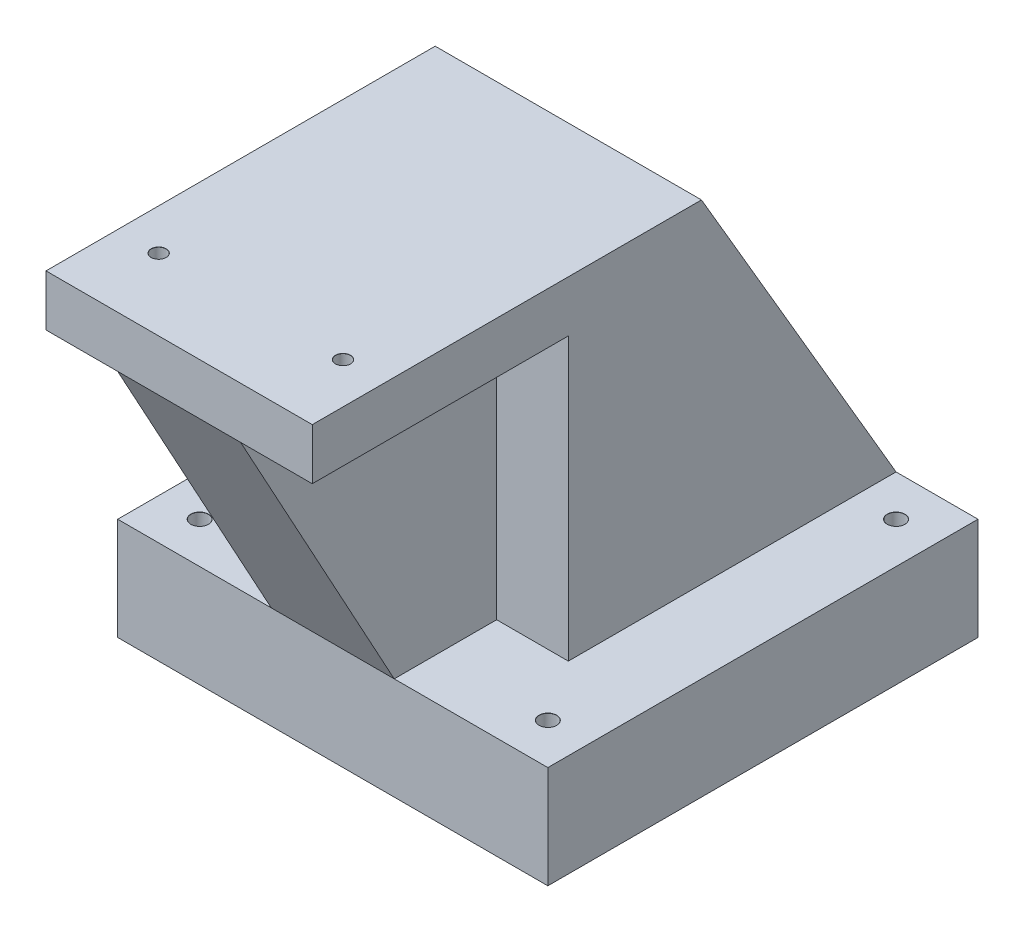
ISO-10303-21;
HEADER;
FILE_DESCRIPTION(('STEP AP214'),'2;1');
FILE_NAME('part.step','',(''),(''),'','','');
FILE_SCHEMA(('AUTOMOTIVE_DESIGN { 1 0 10303 214 1 1 1 1 }'));
ENDSEC;
DATA;
#1=APPLICATION_CONTEXT('core data for automotive mechanical design processes');
#2=APPLICATION_PROTOCOL_DEFINITION('international standard','automotive_design',2000,#1);
#3=PRODUCT_CONTEXT('',#1,'mechanical');
#4=PRODUCT('Part','Part','',(#3));
#5=PRODUCT_RELATED_PRODUCT_CATEGORY('part','',(#4));
#6=PRODUCT_DEFINITION_FORMATION('','',#4);
#7=PRODUCT_DEFINITION_CONTEXT('part definition',#1,'design');
#8=PRODUCT_DEFINITION('design','',#6,#7);
#9=PRODUCT_DEFINITION_SHAPE('','',#8);
#10=(LENGTH_UNIT() NAMED_UNIT(*) SI_UNIT(.MILLI.,.METRE.));
#11=(NAMED_UNIT(*) PLANE_ANGLE_UNIT() SI_UNIT($,.RADIAN.));
#12=(NAMED_UNIT(*) SI_UNIT($,.STERADIAN.) SOLID_ANGLE_UNIT());
#13=UNCERTAINTY_MEASURE_WITH_UNIT(LENGTH_MEASURE(1.E-05),#10,'distance_accuracy_value','');
#14=(GEOMETRIC_REPRESENTATION_CONTEXT(3) GLOBAL_UNCERTAINTY_ASSIGNED_CONTEXT((#13)) GLOBAL_UNIT_ASSIGNED_CONTEXT((#10,
#11,#12)) REPRESENTATION_CONTEXT('',''));
#15=CARTESIAN_POINT('',(0.,0.,0.));
#16=DIRECTION('',(0.,0.,1.));
#17=DIRECTION('',(1.,0.,0.));
#18=AXIS2_PLACEMENT_3D('',#15,#16,#17);
#19=CARTESIAN_POINT('',(0.,20.,0.));
#20=DIRECTION('',(0.,1.,0.));
#21=DIRECTION('',(0.,0.,1.));
#22=AXIS2_PLACEMENT_3D('',#19,#20,#21);
#23=PLANE('',#22);
#24=DIRECTION('',(0.,0.,1.));
#25=VECTOR('',#24,1.);
#26=CARTESIAN_POINT('',(-42.,20.,-42.));
#27=LINE('',#26,#25);
#28=CARTESIAN_POINT('',(-42.,20.,-42.));
#29=VERTEX_POINT('',#28);
#30=CARTESIAN_POINT('',(-42.,20.,42.));
#31=VERTEX_POINT('',#30);
#32=EDGE_CURVE('E244',#29,#31,#27,.T.);
#33=ORIENTED_EDGE('',*,*,#32,.T.);
#34=DIRECTION('',(1.,0.,0.));
#35=VECTOR('',#34,1.);
#36=CARTESIAN_POINT('',(-42.,20.,42.));
#37=LINE('',#36,#35);
#38=CARTESIAN_POINT('',(-12.,20.,42.));
#39=VERTEX_POINT('',#38);
#40=EDGE_CURVE('E112',#31,#39,#37,.T.);
#41=ORIENTED_EDGE('',*,*,#40,.T.);
#42=DIRECTION('',(0.,0.,1.));
#43=VECTOR('',#42,1.);
#44=CARTESIAN_POINT('',(-12.,20.,22.));
#45=LINE('',#44,#43);
#46=CARTESIAN_POINT('',(-12.,20.,22.));
#47=VERTEX_POINT('',#46);
#48=EDGE_CURVE('E178',#47,#39,#45,.T.);
#49=ORIENTED_EDGE('',*,*,#48,.F.);
#50=DIRECTION('',(1.,0.,0.));
#51=VECTOR('',#50,1.);
#52=CARTESIAN_POINT('',(-42.,20.,22.));
#53=LINE('',#52,#51);
#54=CARTESIAN_POINT('',(-26.,20.,22.));
#55=VERTEX_POINT('',#54);
#56=EDGE_CURVE('E168',#55,#47,#53,.T.);
#57=ORIENTED_EDGE('',*,*,#56,.F.);
#58=DIRECTION('',(0.,0.,1.));
#59=VECTOR('',#58,1.);
#60=CARTESIAN_POINT('',(-26.,20.,-4.));
#61=LINE('',#60,#59);
#62=CARTESIAN_POINT('',(-26.,20.,-42.));
#63=VERTEX_POINT('',#62);
#64=EDGE_CURVE('E209',#63,#55,#61,.T.);
#65=ORIENTED_EDGE('',*,*,#64,.F.);
#66=DIRECTION('',(-1.,0.,0.));
#67=VECTOR('',#66,1.);
#68=CARTESIAN_POINT('',(-42.,20.,-42.));
#69=LINE('',#68,#67);
#70=EDGE_CURVE('E71',#63,#29,#69,.T.);
#71=ORIENTED_EDGE('',*,*,#70,.T.);
#72=EDGE_LOOP('',(#33,#41,#49,#57,#65,#71));
#73=FACE_BOUND('',#72,.T.);
#74=CARTESIAN_POINT('',(-34.,20.,-34.));
#75=DIRECTION('',(0.,1.,0.));
#76=DIRECTION('',(0.,0.,1.));
#77=AXIS2_PLACEMENT_3D('',#74,#75,#76);
#78=CIRCLE('',#77,1.725);
#79=CARTESIAN_POINT('',(-34.,20.,-32.275));
#80=VERTEX_POINT('',#79);
#81=EDGE_CURVE('E208',#80,#80,#78,.T.);
#82=ORIENTED_EDGE('',*,*,#81,.F.);
#83=EDGE_LOOP('',(#82));
#84=FACE_BOUND('',#83,.T.);
#85=CARTESIAN_POINT('',(-34.,20.,34.));
#86=DIRECTION('',(0.,1.,0.));
#87=DIRECTION('',(0.,0.,1.));
#88=AXIS2_PLACEMENT_3D('',#85,#86,#87);
#89=CIRCLE('',#88,1.725);
#90=CARTESIAN_POINT('',(-34.,20.,35.725));
#91=VERTEX_POINT('',#90);
#92=EDGE_CURVE('E191',#91,#91,#89,.T.);
#93=ORIENTED_EDGE('',*,*,#92,.F.);
#94=EDGE_LOOP('',(#93));
#95=FACE_BOUND('',#94,.T.);
#96=ADVANCED_FACE('F47',(#73,#84,#95),#23,.T.);
#97=CARTESIAN_POINT('',(42.,20.,-42.));
#98=DIRECTION('',(-1.,0.,0.));
#99=DIRECTION('',(0.,0.,1.));
#100=AXIS2_PLACEMENT_3D('',#97,#98,#99);
#101=PLANE('',#100);
#102=DIRECTION('',(0.,0.,-1.));
#103=VECTOR('',#102,1.);
#104=CARTESIAN_POINT('',(42.,20.,-42.));
#105=LINE('',#104,#103);
#106=CARTESIAN_POINT('',(42.,20.,42.));
#107=VERTEX_POINT('',#106);
#108=CARTESIAN_POINT('',(42.,20.,-42.));
#109=VERTEX_POINT('',#108);
#110=EDGE_CURVE('E103',#107,#109,#105,.T.);
#111=ORIENTED_EDGE('',*,*,#110,.F.);
#112=DIRECTION('',(0.,-1.,0.));
#113=VECTOR('',#112,1.);
#114=CARTESIAN_POINT('',(42.,20.,42.));
#115=LINE('',#114,#113);
#116=CARTESIAN_POINT('',(42.,0.,42.));
#117=VERTEX_POINT('',#116);
#118=EDGE_CURVE('E96',#107,#117,#115,.T.);
#119=ORIENTED_EDGE('',*,*,#118,.T.);
#120=DIRECTION('',(0.,0.,-1.));
#121=VECTOR('',#120,1.);
#122=CARTESIAN_POINT('',(42.,0.,-42.));
#123=LINE('',#122,#121);
#124=CARTESIAN_POINT('',(42.,0.,-42.));
#125=VERTEX_POINT('',#124);
#126=EDGE_CURVE('E110',#117,#125,#123,.T.);
#127=ORIENTED_EDGE('',*,*,#126,.T.);
#128=DIRECTION('',(0.,-1.,0.));
#129=VECTOR('',#128,1.);
#130=CARTESIAN_POINT('',(42.,20.,-42.));
#131=LINE('',#130,#129);
#132=EDGE_CURVE('E131',#109,#125,#131,.T.);
#133=ORIENTED_EDGE('',*,*,#132,.F.);
#134=EDGE_LOOP('',(#111,#119,#127,#133));
#135=FACE_BOUND('',#134,.T.);
#136=ADVANCED_FACE('F49',(#135),#101,.F.);
#137=CARTESIAN_POINT('',(-42.,20.,-42.));
#138=DIRECTION('',(0.,0.,1.));
#139=DIRECTION('',(1.,0.,0.));
#140=AXIS2_PLACEMENT_3D('',#137,#138,#139);
#141=PLANE('',#140);
#142=ORIENTED_EDGE('',*,*,#70,.F.);
#143=DIRECTION('',(1.,0.,0.));
#144=VECTOR('',#143,1.);
#145=CARTESIAN_POINT('',(-204.,20.,-42.));
#146=LINE('',#145,#144);
#147=CARTESIAN_POINT('',(26.,20.,-42.));
#148=VERTEX_POINT('',#147);
#149=EDGE_CURVE('E333',#63,#148,#146,.T.);
#150=ORIENTED_EDGE('',*,*,#149,.T.);
#151=EDGE_CURVE('E243',#109,#148,#69,.T.);
#152=ORIENTED_EDGE('',*,*,#151,.F.);
#153=ORIENTED_EDGE('',*,*,#132,.T.);
#154=DIRECTION('',(-1.,0.,0.));
#155=VECTOR('',#154,1.);
#156=CARTESIAN_POINT('',(-42.,0.,-42.));
#157=LINE('',#156,#155);
#158=CARTESIAN_POINT('',(-42.,0.,-42.));
#159=VERTEX_POINT('',#158);
#160=EDGE_CURVE('E115',#125,#159,#157,.T.);
#161=ORIENTED_EDGE('',*,*,#160,.T.);
#162=DIRECTION('',(0.,-1.,0.));
#163=VECTOR('',#162,1.);
#164=CARTESIAN_POINT('',(-42.,20.,-42.));
#165=LINE('',#164,#163);
#166=EDGE_CURVE('E128',#29,#159,#165,.T.);
#167=ORIENTED_EDGE('',*,*,#166,.F.);
#168=EDGE_LOOP('',(#142,#150,#152,#153,#161,#167));
#169=FACE_BOUND('',#168,.T.);
#170=ADVANCED_FACE('F383',(#169),#141,.F.);
#171=CARTESIAN_POINT('',(-42.,20.,-42.));
#172=DIRECTION('',(1.,0.,0.));
#173=DIRECTION('',(0.,0.,-1.));
#174=AXIS2_PLACEMENT_3D('',#171,#172,#173);
#175=PLANE('',#174);
#176=DIRECTION('',(0.,-1.,0.));
#177=VECTOR('',#176,1.);
#178=CARTESIAN_POINT('',(-42.,20.,42.));
#179=LINE('',#178,#177);
#180=CARTESIAN_POINT('',(-42.,0.,42.));
#181=VERTEX_POINT('',#180);
#182=EDGE_CURVE('E99',#31,#181,#179,.T.);
#183=ORIENTED_EDGE('',*,*,#182,.F.);
#184=ORIENTED_EDGE('',*,*,#32,.F.);
#185=ORIENTED_EDGE('',*,*,#166,.T.);
#186=DIRECTION('',(0.,0.,1.));
#187=VECTOR('',#186,1.);
#188=CARTESIAN_POINT('',(-42.,0.,-42.));
#189=LINE('',#188,#187);
#190=EDGE_CURVE('E104',#159,#181,#189,.T.);
#191=ORIENTED_EDGE('',*,*,#190,.T.);
#192=EDGE_LOOP('',(#183,#184,#185,#191));
#193=FACE_BOUND('',#192,.T.);
#194=ADVANCED_FACE('F393',(#193),#175,.F.);
#195=CARTESIAN_POINT('',(-42.,20.,42.));
#196=DIRECTION('',(0.,0.,-1.));
#197=DIRECTION('',(-1.,0.,0.));
#198=AXIS2_PLACEMENT_3D('',#195,#196,#197);
#199=PLANE('',#198);
#200=DIRECTION('',(1.,0.,0.));
#201=VECTOR('',#200,1.);
#202=CARTESIAN_POINT('',(-42.,0.,42.));
#203=LINE('',#202,#201);
#204=EDGE_CURVE('E92',#181,#117,#203,.T.);
#205=ORIENTED_EDGE('',*,*,#204,.T.);
#206=ORIENTED_EDGE('',*,*,#118,.F.);
#207=CARTESIAN_POINT('',(12.,20.,42.));
#208=VERTEX_POINT('',#207);
#209=EDGE_CURVE('E245',#208,#107,#37,.T.);
#210=ORIENTED_EDGE('',*,*,#209,.F.);
#211=EDGE_CURVE('E249',#39,#208,#37,.T.);
#212=ORIENTED_EDGE('',*,*,#211,.F.);
#213=ORIENTED_EDGE('',*,*,#40,.F.);
#214=ORIENTED_EDGE('',*,*,#182,.T.);
#215=EDGE_LOOP('',(#205,#206,#210,#212,#213,#214));
#216=FACE_BOUND('',#215,.T.);
#217=ADVANCED_FACE('F94',(#216),#199,.F.);
#218=DIRECTION('',(0.,0.,-1.));
#219=VECTOR('',#218,1.);
#220=CARTESIAN_POINT('',(26.,20.,-4.));
#221=LINE('',#220,#219);
#222=CARTESIAN_POINT('',(26.,20.,22.));
#223=VERTEX_POINT('',#222);
#224=EDGE_CURVE('E62',#223,#148,#221,.T.);
#225=ORIENTED_EDGE('',*,*,#224,.F.);
#226=DIRECTION('',(1.,0.,0.));
#227=VECTOR('',#226,1.);
#228=CARTESIAN_POINT('',(42.,20.,22.));
#229=LINE('',#228,#227);
#230=CARTESIAN_POINT('',(12.,20.,22.));
#231=VERTEX_POINT('',#230);
#232=EDGE_CURVE('E147',#231,#223,#229,.T.);
#233=ORIENTED_EDGE('',*,*,#232,.F.);
#234=DIRECTION('',(0.,0.,1.));
#235=VECTOR('',#234,1.);
#236=CARTESIAN_POINT('',(12.,20.,22.));
#237=LINE('',#236,#235);
#238=EDGE_CURVE('E156',#231,#208,#237,.T.);
#239=ORIENTED_EDGE('',*,*,#238,.T.);
#240=ORIENTED_EDGE('',*,*,#209,.T.);
#241=ORIENTED_EDGE('',*,*,#110,.T.);
#242=ORIENTED_EDGE('',*,*,#151,.T.);
#243=EDGE_LOOP('',(#225,#233,#239,#240,#241,#242));
#244=FACE_BOUND('',#243,.T.);
#245=CARTESIAN_POINT('',(34.,20.,-34.));
#246=DIRECTION('',(0.,1.,0.));
#247=DIRECTION('',(0.,0.,1.));
#248=AXIS2_PLACEMENT_3D('',#245,#246,#247);
#249=CIRCLE('',#248,1.725);
#250=CARTESIAN_POINT('',(34.,20.,-32.275));
#251=VERTEX_POINT('',#250);
#252=EDGE_CURVE('E221',#251,#251,#249,.T.);
#253=ORIENTED_EDGE('',*,*,#252,.F.);
#254=EDGE_LOOP('',(#253));
#255=FACE_BOUND('',#254,.T.);
#256=CARTESIAN_POINT('',(34.,20.,34.));
#257=DIRECTION('',(0.,1.,0.));
#258=DIRECTION('',(0.,0.,1.));
#259=AXIS2_PLACEMENT_3D('',#256,#257,#258);
#260=CIRCLE('',#259,1.725);
#261=CARTESIAN_POINT('',(34.,20.,35.725));
#262=VERTEX_POINT('',#261);
#263=EDGE_CURVE('E196',#262,#262,#260,.T.);
#264=ORIENTED_EDGE('',*,*,#263,.F.);
#265=EDGE_LOOP('',(#264));
#266=FACE_BOUND('',#265,.T.);
#267=ADVANCED_FACE('F353',(#244,#255,#266),#23,.T.);
#268=CARTESIAN_POINT('',(0.,0.,0.));
#269=DIRECTION('',(0.,1.,0.));
#270=DIRECTION('',(0.,0.,1.));
#271=AXIS2_PLACEMENT_3D('',#268,#269,#270);
#272=PLANE('',#271);
#273=CARTESIAN_POINT('',(-34.,0.,-34.));
#274=DIRECTION('',(0.,1.,0.));
#275=DIRECTION('',(0.,0.,1.));
#276=AXIS2_PLACEMENT_3D('',#273,#274,#275);
#277=CIRCLE('',#276,1.69999999999999);
#278=CARTESIAN_POINT('',(-34.,0.,-32.3));
#279=VERTEX_POINT('',#278);
#280=EDGE_CURVE('E218',#279,#279,#277,.T.);
#281=ORIENTED_EDGE('',*,*,#280,.T.);
#282=EDGE_LOOP('',(#281));
#283=FACE_BOUND('',#282,.T.);
#284=CARTESIAN_POINT('',(34.,0.,-34.));
#285=DIRECTION('',(0.,1.,0.));
#286=DIRECTION('',(0.,0.,1.));
#287=AXIS2_PLACEMENT_3D('',#284,#285,#286);
#288=CIRCLE('',#287,1.69999999999999);
#289=CARTESIAN_POINT('',(34.,0.,-32.3));
#290=VERTEX_POINT('',#289);
#291=EDGE_CURVE('E227',#290,#290,#288,.T.);
#292=ORIENTED_EDGE('',*,*,#291,.T.);
#293=EDGE_LOOP('',(#292));
#294=FACE_BOUND('',#293,.T.);
#295=CARTESIAN_POINT('',(34.,0.,34.));
#296=DIRECTION('',(0.,1.,0.));
#297=DIRECTION('',(0.,0.,1.));
#298=AXIS2_PLACEMENT_3D('',#295,#296,#297);
#299=CIRCLE('',#298,1.69999999999999);
#300=CARTESIAN_POINT('',(34.,0.,35.7));
#301=VERTEX_POINT('',#300);
#302=EDGE_CURVE('E235',#301,#301,#299,.T.);
#303=ORIENTED_EDGE('',*,*,#302,.T.);
#304=EDGE_LOOP('',(#303));
#305=FACE_BOUND('',#304,.T.);
#306=CARTESIAN_POINT('',(-34.,0.,34.));
#307=DIRECTION('',(0.,1.,0.));
#308=DIRECTION('',(0.,0.,1.));
#309=AXIS2_PLACEMENT_3D('',#306,#307,#308);
#310=CIRCLE('',#309,1.69999999999999);
#311=CARTESIAN_POINT('',(-34.,0.,35.7));
#312=VERTEX_POINT('',#311);
#313=EDGE_CURVE('E117',#312,#312,#310,.T.);
#314=ORIENTED_EDGE('',*,*,#313,.T.);
#315=EDGE_LOOP('',(#314));
#316=FACE_BOUND('',#315,.T.);
#317=ORIENTED_EDGE('',*,*,#126,.F.);
#318=ORIENTED_EDGE('',*,*,#204,.F.);
#319=ORIENTED_EDGE('',*,*,#190,.F.);
#320=ORIENTED_EDGE('',*,*,#160,.F.);
#321=EDGE_LOOP('',(#317,#318,#319,#320));
#322=FACE_BOUND('',#321,.T.);
#323=ADVANCED_FACE('F114',(#283,#294,#305,#316,#322),#272,.F.);
#324=CARTESIAN_POINT('',(-34.,20.,34.));
#325=DIRECTION('',(0.,1.,0.));
#326=DIRECTION('',(0.,0.,1.));
#327=AXIS2_PLACEMENT_3D('',#324,#325,#326);
#328=CYLINDRICAL_SURFACE('',#327,1.69999999999999);
#329=ORIENTED_EDGE('',*,*,#313,.F.);
#330=EDGE_LOOP('',(#329));
#331=FACE_BOUND('',#330,.T.);
#332=CARTESIAN_POINT('',(-34.,19.975,34.));
#333=DIRECTION('',(0.,1.,0.));
#334=DIRECTION('',(0.,0.,1.));
#335=AXIS2_PLACEMENT_3D('',#332,#333,#334);
#336=CIRCLE('',#335,1.69999999999999);
#337=CARTESIAN_POINT('',(-34.,19.975,35.7));
#338=VERTEX_POINT('',#337);
#339=EDGE_CURVE('E121',#338,#338,#336,.T.);
#340=ORIENTED_EDGE('',*,*,#339,.T.);
#341=EDGE_LOOP('',(#340));
#342=FACE_BOUND('',#341,.T.);
#343=ADVANCED_FACE('F386',(#331,#342),#328,.F.);
#344=CARTESIAN_POINT('',(-34.,20.,34.));
#345=DIRECTION('',(0.,1.,0.));
#346=DIRECTION('',(0.,0.,1.));
#347=AXIS2_PLACEMENT_3D('',#344,#345,#346);
#348=CONICAL_SURFACE('',#347,1.725,0.785398163397101);
#349=ORIENTED_EDGE('',*,*,#339,.F.);
#350=EDGE_LOOP('',(#349));
#351=FACE_BOUND('',#350,.T.);
#352=ORIENTED_EDGE('',*,*,#92,.T.);
#353=EDGE_LOOP('',(#352));
#354=FACE_BOUND('',#353,.T.);
#355=ADVANCED_FACE('F374',(#351,#354),#348,.F.);
#356=CARTESIAN_POINT('',(34.,20.,34.));
#357=DIRECTION('',(0.,1.,0.));
#358=DIRECTION('',(0.,0.,1.));
#359=AXIS2_PLACEMENT_3D('',#356,#357,#358);
#360=CYLINDRICAL_SURFACE('',#359,1.69999999999999);
#361=ORIENTED_EDGE('',*,*,#302,.F.);
#362=EDGE_LOOP('',(#361));
#363=FACE_BOUND('',#362,.T.);
#364=CARTESIAN_POINT('',(34.,19.975,34.));
#365=DIRECTION('',(0.,1.,0.));
#366=DIRECTION('',(0.,0.,1.));
#367=AXIS2_PLACEMENT_3D('',#364,#365,#366);
#368=CIRCLE('',#367,1.69999999999999);
#369=CARTESIAN_POINT('',(34.,19.975,35.7));
#370=VERTEX_POINT('',#369);
#371=EDGE_CURVE('E230',#370,#370,#368,.T.);
#372=ORIENTED_EDGE('',*,*,#371,.T.);
#373=EDGE_LOOP('',(#372));
#374=FACE_BOUND('',#373,.T.);
#375=ADVANCED_FACE('F364',(#363,#374),#360,.F.);
#376=CARTESIAN_POINT('',(34.,20.,34.));
#377=DIRECTION('',(0.,1.,0.));
#378=DIRECTION('',(0.,0.,1.));
#379=AXIS2_PLACEMENT_3D('',#376,#377,#378);
#380=CONICAL_SURFACE('',#379,1.725,0.785398163397101);
#381=ORIENTED_EDGE('',*,*,#371,.F.);
#382=EDGE_LOOP('',(#381));
#383=FACE_BOUND('',#382,.T.);
#384=ORIENTED_EDGE('',*,*,#263,.T.);
#385=EDGE_LOOP('',(#384));
#386=FACE_BOUND('',#385,.T.);
#387=ADVANCED_FACE('F361',(#383,#386),#380,.F.);
#388=CARTESIAN_POINT('',(34.,20.,-34.));
#389=DIRECTION('',(0.,1.,0.));
#390=DIRECTION('',(0.,0.,1.));
#391=AXIS2_PLACEMENT_3D('',#388,#389,#390);
#392=CYLINDRICAL_SURFACE('',#391,1.69999999999999);
#393=ORIENTED_EDGE('',*,*,#291,.F.);
#394=EDGE_LOOP('',(#393));
#395=FACE_BOUND('',#394,.T.);
#396=CARTESIAN_POINT('',(34.,19.975,-34.));
#397=DIRECTION('',(0.,1.,0.));
#398=DIRECTION('',(0.,0.,1.));
#399=AXIS2_PLACEMENT_3D('',#396,#397,#398);
#400=CIRCLE('',#399,1.69999999999999);
#401=CARTESIAN_POINT('',(34.,19.975,-32.3));
#402=VERTEX_POINT('',#401);
#403=EDGE_CURVE('E224',#402,#402,#400,.T.);
#404=ORIENTED_EDGE('',*,*,#403,.T.);
#405=EDGE_LOOP('',(#404));
#406=FACE_BOUND('',#405,.T.);
#407=ADVANCED_FACE('F363',(#395,#406),#392,.F.);
#408=CARTESIAN_POINT('',(34.,20.,-34.));
#409=DIRECTION('',(0.,1.,0.));
#410=DIRECTION('',(0.,0.,1.));
#411=AXIS2_PLACEMENT_3D('',#408,#409,#410);
#412=CONICAL_SURFACE('',#411,1.725,0.78539816339724);
#413=ORIENTED_EDGE('',*,*,#403,.F.);
#414=EDGE_LOOP('',(#413));
#415=FACE_BOUND('',#414,.T.);
#416=ORIENTED_EDGE('',*,*,#252,.T.);
#417=EDGE_LOOP('',(#416));
#418=FACE_BOUND('',#417,.T.);
#419=ADVANCED_FACE('F371',(#415,#418),#412,.F.);
#420=CARTESIAN_POINT('',(-34.,20.,-34.));
#421=DIRECTION('',(0.,1.,0.));
#422=DIRECTION('',(0.,0.,1.));
#423=AXIS2_PLACEMENT_3D('',#420,#421,#422);
#424=CYLINDRICAL_SURFACE('',#423,1.69999999999999);
#425=ORIENTED_EDGE('',*,*,#280,.F.);
#426=EDGE_LOOP('',(#425));
#427=FACE_BOUND('',#426,.T.);
#428=CARTESIAN_POINT('',(-34.,19.975,-34.));
#429=DIRECTION('',(0.,1.,0.));
#430=DIRECTION('',(0.,0.,1.));
#431=AXIS2_PLACEMENT_3D('',#428,#429,#430);
#432=CIRCLE('',#431,1.69999999999999);
#433=CARTESIAN_POINT('',(-34.,19.975,-32.3));
#434=VERTEX_POINT('',#433);
#435=EDGE_CURVE('E215',#434,#434,#432,.T.);
#436=ORIENTED_EDGE('',*,*,#435,.T.);
#437=EDGE_LOOP('',(#436));
#438=FACE_BOUND('',#437,.T.);
#439=ADVANCED_FACE('F433',(#427,#438),#424,.F.);
#440=CARTESIAN_POINT('',(-34.,20.,-34.));
#441=DIRECTION('',(0.,1.,0.));
#442=DIRECTION('',(0.,0.,1.));
#443=AXIS2_PLACEMENT_3D('',#440,#441,#442);
#444=CONICAL_SURFACE('',#443,1.725,0.78539816339724);
#445=ORIENTED_EDGE('',*,*,#435,.F.);
#446=EDGE_LOOP('',(#445));
#447=FACE_BOUND('',#446,.T.);
#448=ORIENTED_EDGE('',*,*,#81,.T.);
#449=EDGE_LOOP('',(#448));
#450=FACE_BOUND('',#449,.T.);
#451=ADVANCED_FACE('F424',(#447,#450),#444,.F.);
#452=CARTESIAN_POINT('',(0.,85.,0.));
#453=DIRECTION('',(0.,1.,0.));
#454=DIRECTION('',(0.,0.,1.));
#455=AXIS2_PLACEMENT_3D('',#452,#453,#454);
#456=PLANE('',#455);
#457=DIRECTION('',(0.,0.,-1.));
#458=VECTOR('',#457,1.);
#459=CARTESIAN_POINT('',(26.,85.,226.));
#460=LINE('',#459,#458);
#461=CARTESIAN_POINT('',(26.,85.,72.));
#462=VERTEX_POINT('',#461);
#463=CARTESIAN_POINT('',(26.,85.,-4.));
#464=VERTEX_POINT('',#463);
#465=EDGE_CURVE('E316',#462,#464,#460,.T.);
#466=ORIENTED_EDGE('',*,*,#465,.T.);
#467=DIRECTION('',(1.,0.,0.));
#468=VECTOR('',#467,1.);
#469=CARTESIAN_POINT('',(-204.,85.,-4.));
#470=LINE('',#469,#468);
#471=CARTESIAN_POINT('',(-26.,85.,-4.));
#472=VERTEX_POINT('',#471);
#473=EDGE_CURVE('E321',#472,#464,#470,.T.);
#474=ORIENTED_EDGE('',*,*,#473,.F.);
#475=DIRECTION('',(0.,0.,-1.));
#476=VECTOR('',#475,1.);
#477=CARTESIAN_POINT('',(-26.,85.,226.));
#478=LINE('',#477,#476);
#479=CARTESIAN_POINT('',(-26.,85.,72.));
#480=VERTEX_POINT('',#479);
#481=EDGE_CURVE('E324',#480,#472,#478,.T.);
#482=ORIENTED_EDGE('',*,*,#481,.F.);
#483=DIRECTION('',(1.,0.,0.));
#484=VECTOR('',#483,1.);
#485=CARTESIAN_POINT('',(-42.,85.,72.));
#486=LINE('',#485,#484);
#487=EDGE_CURVE('E205',#480,#462,#486,.T.);
#488=ORIENTED_EDGE('',*,*,#487,.T.);
#489=EDGE_LOOP('',(#466,#474,#482,#488));
#490=FACE_BOUND('',#489,.T.);
#491=CARTESIAN_POINT('',(-18.,85.,58.));
#492=DIRECTION('',(0.,1.,0.));
#493=DIRECTION('',(0.,0.,1.));
#494=AXIS2_PLACEMENT_3D('',#491,#492,#493);
#495=CIRCLE('',#494,1.475);
#496=CARTESIAN_POINT('',(-18.,85.,59.475));
#497=VERTEX_POINT('',#496);
#498=EDGE_CURVE('E192',#497,#497,#495,.T.);
#499=ORIENTED_EDGE('',*,*,#498,.F.);
#500=EDGE_LOOP('',(#499));
#501=FACE_BOUND('',#500,.T.);
#502=CARTESIAN_POINT('',(18.,85.,58.));
#503=DIRECTION('',(0.,1.,0.));
#504=DIRECTION('',(0.,0.,1.));
#505=AXIS2_PLACEMENT_3D('',#502,#503,#504);
#506=CIRCLE('',#505,1.475);
#507=CARTESIAN_POINT('',(18.,85.,59.475));
#508=VERTEX_POINT('',#507);
#509=EDGE_CURVE('E199',#508,#508,#506,.T.);
#510=ORIENTED_EDGE('',*,*,#509,.F.);
#511=EDGE_LOOP('',(#510));
#512=FACE_BOUND('',#511,.T.);
#513=ADVANCED_FACE('F318',(#490,#501,#512),#456,.T.);
#514=CARTESIAN_POINT('',(-42.,85.,72.));
#515=DIRECTION('',(0.,0.,-1.));
#516=DIRECTION('',(-1.,0.,0.));
#517=AXIS2_PLACEMENT_3D('',#514,#515,#516);
#518=PLANE('',#517);
#519=DIRECTION('',(-1.,0.,0.));
#520=VECTOR('',#519,1.);
#521=CARTESIAN_POINT('',(42.,75.,72.));
#522=LINE('',#521,#520);
#523=CARTESIAN_POINT('',(26.,75.,72.));
#524=VERTEX_POINT('',#523);
#525=CARTESIAN_POINT('',(12.,75.,72.));
#526=VERTEX_POINT('',#525);
#527=EDGE_CURVE('E162',#524,#526,#522,.T.);
#528=ORIENTED_EDGE('',*,*,#527,.F.);
#529=DIRECTION('',(0.,1.,0.));
#530=VECTOR('',#529,1.);
#531=CARTESIAN_POINT('',(26.,85.,72.));
#532=LINE('',#531,#530);
#533=EDGE_CURVE('E411',#524,#462,#532,.T.);
#534=ORIENTED_EDGE('',*,*,#533,.T.);
#535=ORIENTED_EDGE('',*,*,#487,.F.);
#536=DIRECTION('',(0.,-1.,0.));
#537=VECTOR('',#536,1.);
#538=CARTESIAN_POINT('',(-26.,85.,72.));
#539=LINE('',#538,#537);
#540=CARTESIAN_POINT('',(-26.,75.,72.));
#541=VERTEX_POINT('',#540);
#542=EDGE_CURVE('E335',#480,#541,#539,.T.);
#543=ORIENTED_EDGE('',*,*,#542,.T.);
#544=DIRECTION('',(-1.,0.,0.));
#545=VECTOR('',#544,1.);
#546=CARTESIAN_POINT('',(-42.,75.,72.));
#547=LINE('',#546,#545);
#548=CARTESIAN_POINT('',(-12.,75.,72.));
#549=VERTEX_POINT('',#548);
#550=EDGE_CURVE('E172',#549,#541,#547,.T.);
#551=ORIENTED_EDGE('',*,*,#550,.F.);
#552=DIRECTION('',(1.,0.,0.));
#553=VECTOR('',#552,1.);
#554=CARTESIAN_POINT('',(-42.,75.,72.));
#555=LINE('',#554,#553);
#556=EDGE_CURVE('E270',#549,#526,#555,.T.);
#557=ORIENTED_EDGE('',*,*,#556,.T.);
#558=EDGE_LOOP('',(#528,#534,#535,#543,#551,#557));
#559=FACE_BOUND('',#558,.T.);
#560=ADVANCED_FACE('F416',(#559),#518,.F.);
#561=CARTESIAN_POINT('',(-26.,85.,-4.));
#562=DIRECTION('',(1.,0.,0.));
#563=DIRECTION('',(0.,0.,-1.));
#564=AXIS2_PLACEMENT_3D('',#561,#562,#563);
#565=PLANE('',#564);
#566=ORIENTED_EDGE('',*,*,#64,.T.);
#567=DIRECTION('',(0.,-1.,0.));
#568=VECTOR('',#567,1.);
#569=CARTESIAN_POINT('',(-26.,0.,22.));
#570=LINE('',#569,#568);
#571=CARTESIAN_POINT('',(-26.,75.,22.));
#572=VERTEX_POINT('',#571);
#573=EDGE_CURVE('E11',#572,#55,#570,.T.);
#574=ORIENTED_EDGE('',*,*,#573,.F.);
#575=DIRECTION('',(0.,0.,-1.));
#576=VECTOR('',#575,1.);
#577=CARTESIAN_POINT('',(-26.,75.,22.));
#578=LINE('',#577,#576);
#579=EDGE_CURVE('E338',#541,#572,#578,.T.);
#580=ORIENTED_EDGE('',*,*,#579,.F.);
#581=ORIENTED_EDGE('',*,*,#542,.F.);
#582=ORIENTED_EDGE('',*,*,#481,.T.);
#583=DIRECTION('',(0.,-0.863296794119082,-0.504696587331156));
#584=VECTOR('',#583,1.);
#585=CARTESIAN_POINT('',(-26.,85.,-4.));
#586=LINE('',#585,#584);
#587=EDGE_CURVE('E332',#472,#63,#586,.T.);
#588=ORIENTED_EDGE('',*,*,#587,.T.);
#589=EDGE_LOOP('',(#566,#574,#580,#581,#582,#588));
#590=FACE_BOUND('',#589,.T.);
#591=ADVANCED_FACE('F402',(#590),#565,.F.);
#592=CARTESIAN_POINT('',(26.,85.,-4.));
#593=DIRECTION('',(-1.,0.,0.));
#594=DIRECTION('',(0.,0.,1.));
#595=AXIS2_PLACEMENT_3D('',#592,#593,#594);
#596=PLANE('',#595);
#597=ORIENTED_EDGE('',*,*,#224,.T.);
#598=DIRECTION('',(0.,-0.863296794119082,-0.504696587331156));
#599=VECTOR('',#598,1.);
#600=CARTESIAN_POINT('',(26.,85.,-4.));
#601=LINE('',#600,#599);
#602=EDGE_CURVE('E329',#464,#148,#601,.T.);
#603=ORIENTED_EDGE('',*,*,#602,.F.);
#604=ORIENTED_EDGE('',*,*,#465,.F.);
#605=ORIENTED_EDGE('',*,*,#533,.F.);
#606=DIRECTION('',(0.,0.,1.));
#607=VECTOR('',#606,1.);
#608=CARTESIAN_POINT('',(26.,75.,22.));
#609=LINE('',#608,#607);
#610=CARTESIAN_POINT('',(26.,75.,22.));
#611=VERTEX_POINT('',#610);
#612=EDGE_CURVE('E142',#611,#524,#609,.T.);
#613=ORIENTED_EDGE('',*,*,#612,.F.);
#614=DIRECTION('',(0.,-1.,0.));
#615=VECTOR('',#614,1.);
#616=CARTESIAN_POINT('',(26.,0.,22.));
#617=LINE('',#616,#615);
#618=EDGE_CURVE('E55',#611,#223,#617,.T.);
#619=ORIENTED_EDGE('',*,*,#618,.T.);
#620=EDGE_LOOP('',(#597,#603,#604,#605,#613,#619));
#621=FACE_BOUND('',#620,.T.);
#622=ADVANCED_FACE('F136',(#621),#596,.F.);
#623=CARTESIAN_POINT('',(18.,85.,58.));
#624=DIRECTION('',(0.,1.,0.));
#625=DIRECTION('',(0.,0.,1.));
#626=AXIS2_PLACEMENT_3D('',#623,#624,#625);
#627=CYLINDRICAL_SURFACE('',#626,1.44999999999999);
#628=CARTESIAN_POINT('',(18.,75.,58.));
#629=DIRECTION('',(0.,1.,0.));
#630=DIRECTION('',(0.,0.,1.));
#631=AXIS2_PLACEMENT_3D('',#628,#629,#630);
#632=CIRCLE('',#631,1.44999999999999);
#633=CARTESIAN_POINT('',(18.,75.,59.45));
#634=VERTEX_POINT('',#633);
#635=EDGE_CURVE('E188',#634,#634,#632,.F.);
#636=ORIENTED_EDGE('',*,*,#635,.T.);
#637=EDGE_LOOP('',(#636));
#638=FACE_BOUND('',#637,.T.);
#639=CARTESIAN_POINT('',(18.,84.975,58.));
#640=DIRECTION('',(0.,1.,0.));
#641=DIRECTION('',(0.,0.,1.));
#642=AXIS2_PLACEMENT_3D('',#639,#640,#641);
#643=CIRCLE('',#642,1.45);
#644=CARTESIAN_POINT('',(18.,84.975,59.45));
#645=VERTEX_POINT('',#644);
#646=EDGE_CURVE('E202',#645,#645,#643,.T.);
#647=ORIENTED_EDGE('',*,*,#646,.T.);
#648=EDGE_LOOP('',(#647));
#649=FACE_BOUND('',#648,.T.);
#650=ADVANCED_FACE('F430',(#638,#649),#627,.F.);
#651=CARTESIAN_POINT('',(18.,85.,58.));
#652=DIRECTION('',(0.,1.,0.));
#653=DIRECTION('',(0.,0.,1.));
#654=AXIS2_PLACEMENT_3D('',#651,#652,#653);
#655=CONICAL_SURFACE('',#654,1.475,0.785398163397518);
#656=ORIENTED_EDGE('',*,*,#646,.F.);
#657=EDGE_LOOP('',(#656));
#658=FACE_BOUND('',#657,.T.);
#659=ORIENTED_EDGE('',*,*,#509,.T.);
#660=EDGE_LOOP('',(#659));
#661=FACE_BOUND('',#660,.T.);
#662=ADVANCED_FACE('F462',(#658,#661),#655,.F.);
#663=CARTESIAN_POINT('',(-18.,85.,58.));
#664=DIRECTION('',(0.,1.,0.));
#665=DIRECTION('',(0.,0.,1.));
#666=AXIS2_PLACEMENT_3D('',#663,#664,#665);
#667=CYLINDRICAL_SURFACE('',#666,1.44999999999999);
#668=CARTESIAN_POINT('',(-18.,75.,58.));
#669=DIRECTION('',(0.,1.,0.));
#670=DIRECTION('',(0.,0.,1.));
#671=AXIS2_PLACEMENT_3D('',#668,#669,#670);
#672=CIRCLE('',#671,1.44999999999999);
#673=CARTESIAN_POINT('',(-18.,75.,59.45));
#674=VERTEX_POINT('',#673);
#675=EDGE_CURVE('E166',#674,#674,#672,.F.);
#676=ORIENTED_EDGE('',*,*,#675,.T.);
#677=EDGE_LOOP('',(#676));
#678=FACE_BOUND('',#677,.T.);
#679=CARTESIAN_POINT('',(-18.,84.975,58.));
#680=DIRECTION('',(0.,1.,0.));
#681=DIRECTION('',(0.,0.,1.));
#682=AXIS2_PLACEMENT_3D('',#679,#680,#681);
#683=CIRCLE('',#682,1.45);
#684=CARTESIAN_POINT('',(-18.,84.975,59.45));
#685=VERTEX_POINT('',#684);
#686=EDGE_CURVE('E195',#685,#685,#683,.T.);
#687=ORIENTED_EDGE('',*,*,#686,.T.);
#688=EDGE_LOOP('',(#687));
#689=FACE_BOUND('',#688,.T.);
#690=ADVANCED_FACE('F470',(#678,#689),#667,.F.);
#691=CARTESIAN_POINT('',(-18.,85.,58.));
#692=DIRECTION('',(0.,1.,0.));
#693=DIRECTION('',(0.,0.,1.));
#694=AXIS2_PLACEMENT_3D('',#691,#692,#693);
#695=CONICAL_SURFACE('',#694,1.475,0.785398163397518);
#696=ORIENTED_EDGE('',*,*,#686,.F.);
#697=EDGE_LOOP('',(#696));
#698=FACE_BOUND('',#697,.T.);
#699=ORIENTED_EDGE('',*,*,#498,.T.);
#700=EDGE_LOOP('',(#699));
#701=FACE_BOUND('',#700,.T.);
#702=ADVANCED_FACE('F478',(#698,#701),#695,.F.);
#703=CARTESIAN_POINT('',(-42.,75.,22.));
#704=DIRECTION('',(0.,1.,0.));
#705=DIRECTION('',(0.,0.,1.));
#706=AXIS2_PLACEMENT_3D('',#703,#704,#705);
#707=PLANE('',#706);
#708=ORIENTED_EDGE('',*,*,#550,.T.);
#709=ORIENTED_EDGE('',*,*,#579,.T.);
#710=DIRECTION('',(-1.,0.,0.));
#711=VECTOR('',#710,1.);
#712=CARTESIAN_POINT('',(-42.,75.,22.));
#713=LINE('',#712,#711);
#714=CARTESIAN_POINT('',(-12.,75.,22.));
#715=VERTEX_POINT('',#714);
#716=EDGE_CURVE('E175',#715,#572,#713,.T.);
#717=ORIENTED_EDGE('',*,*,#716,.F.);
#718=DIRECTION('',(0.,0.,1.));
#719=VECTOR('',#718,1.);
#720=CARTESIAN_POINT('',(-12.,75.,22.));
#721=LINE('',#720,#719);
#722=EDGE_CURVE('E165',#715,#549,#721,.T.);
#723=ORIENTED_EDGE('',*,*,#722,.T.);
#724=EDGE_LOOP('',(#708,#709,#717,#723));
#725=FACE_BOUND('',#724,.T.);
#726=ORIENTED_EDGE('',*,*,#675,.F.);
#727=EDGE_LOOP('',(#726));
#728=FACE_BOUND('',#727,.T.);
#729=ADVANCED_FACE('F408',(#725,#728),#707,.F.);
#730=CARTESIAN_POINT('',(-12.,20.,22.));
#731=DIRECTION('',(1.,0.,0.));
#732=DIRECTION('',(0.,0.,-1.));
#733=AXIS2_PLACEMENT_3D('',#730,#731,#732);
#734=PLANE('',#733);
#735=ORIENTED_EDGE('',*,*,#48,.T.);
#736=DIRECTION('',(0.,0.877895572914384,0.478852130680573));
#737=VECTOR('',#736,1.);
#738=CARTESIAN_POINT('',(-12.,11.5923566878981,37.4140127388535));
#739=LINE('',#738,#737);
#740=EDGE_CURVE('E181',#39,#549,#739,.T.);
#741=ORIENTED_EDGE('',*,*,#740,.T.);
#742=ORIENTED_EDGE('',*,*,#722,.F.);
#743=DIRECTION('',(0.,1.,0.));
#744=VECTOR('',#743,1.);
#745=CARTESIAN_POINT('',(-12.,20.,22.));
#746=LINE('',#745,#744);
#747=EDGE_CURVE('E171',#47,#715,#746,.T.);
#748=ORIENTED_EDGE('',*,*,#747,.F.);
#749=EDGE_LOOP('',(#735,#741,#742,#748));
#750=FACE_BOUND('',#749,.T.);
#751=ADVANCED_FACE('F274',(#750),#734,.F.);
#752=CARTESIAN_POINT('',(0.,0.,22.));
#753=DIRECTION('',(0.,0.,-1.));
#754=DIRECTION('',(-1.,0.,0.));
#755=AXIS2_PLACEMENT_3D('',#752,#753,#754);
#756=PLANE('',#755);
#757=ORIENTED_EDGE('',*,*,#716,.T.);
#758=ORIENTED_EDGE('',*,*,#573,.T.);
#759=ORIENTED_EDGE('',*,*,#56,.T.);
#760=ORIENTED_EDGE('',*,*,#747,.T.);
#761=EDGE_LOOP('',(#757,#758,#759,#760));
#762=FACE_BOUND('',#761,.T.);
#763=ADVANCED_FACE('F404',(#762),#756,.F.);
#764=CARTESIAN_POINT('',(42.,75.,22.));
#765=DIRECTION('',(0.,1.,0.));
#766=DIRECTION('',(0.,0.,1.));
#767=AXIS2_PLACEMENT_3D('',#764,#765,#766);
#768=PLANE('',#767);
#769=DIRECTION('',(-1.,0.,0.));
#770=VECTOR('',#769,1.);
#771=CARTESIAN_POINT('',(42.,75.,22.));
#772=LINE('',#771,#770);
#773=CARTESIAN_POINT('',(12.,75.,22.));
#774=VERTEX_POINT('',#773);
#775=EDGE_CURVE('E158',#611,#774,#772,.T.);
#776=ORIENTED_EDGE('',*,*,#775,.F.);
#777=ORIENTED_EDGE('',*,*,#612,.T.);
#778=ORIENTED_EDGE('',*,*,#527,.T.);
#779=DIRECTION('',(0.,0.,1.));
#780=VECTOR('',#779,1.);
#781=CARTESIAN_POINT('',(12.,75.,22.));
#782=LINE('',#781,#780);
#783=EDGE_CURVE('E153',#774,#526,#782,.T.);
#784=ORIENTED_EDGE('',*,*,#783,.F.);
#785=EDGE_LOOP('',(#776,#777,#778,#784));
#786=FACE_BOUND('',#785,.T.);
#787=ORIENTED_EDGE('',*,*,#635,.F.);
#788=EDGE_LOOP('',(#787));
#789=FACE_BOUND('',#788,.T.);
#790=ADVANCED_FACE('F348',(#786,#789),#768,.F.);
#791=CARTESIAN_POINT('',(12.,20.,22.));
#792=DIRECTION('',(-1.,0.,0.));
#793=DIRECTION('',(0.,0.,1.));
#794=AXIS2_PLACEMENT_3D('',#791,#792,#793);
#795=PLANE('',#794);
#796=ORIENTED_EDGE('',*,*,#783,.T.);
#797=DIRECTION('',(0.,0.877895572914384,0.478852130680573));
#798=VECTOR('',#797,1.);
#799=CARTESIAN_POINT('',(12.,20.,42.));
#800=LINE('',#799,#798);
#801=EDGE_CURVE('E344',#208,#526,#800,.T.);
#802=ORIENTED_EDGE('',*,*,#801,.F.);
#803=ORIENTED_EDGE('',*,*,#238,.F.);
#804=DIRECTION('',(0.,-1.,0.));
#805=VECTOR('',#804,1.);
#806=CARTESIAN_POINT('',(12.,20.,22.));
#807=LINE('',#806,#805);
#808=EDGE_CURVE('E151',#774,#231,#807,.T.);
#809=ORIENTED_EDGE('',*,*,#808,.F.);
#810=EDGE_LOOP('',(#796,#802,#803,#809));
#811=FACE_BOUND('',#810,.T.);
#812=ADVANCED_FACE('F352',(#811),#795,.F.);
#813=CARTESIAN_POINT('',(0.,0.,22.));
#814=DIRECTION('',(0.,0.,1.));
#815=DIRECTION('',(1.,0.,0.));
#816=AXIS2_PLACEMENT_3D('',#813,#814,#815);
#817=PLANE('',#816);
#818=ORIENTED_EDGE('',*,*,#618,.F.);
#819=ORIENTED_EDGE('',*,*,#775,.T.);
#820=ORIENTED_EDGE('',*,*,#808,.T.);
#821=ORIENTED_EDGE('',*,*,#232,.T.);
#822=EDGE_LOOP('',(#818,#819,#820,#821));
#823=FACE_BOUND('',#822,.T.);
#824=ADVANCED_FACE('F148',(#823),#817,.T.);
#825=CARTESIAN_POINT('',(-42.,20.,42.));
#826=DIRECTION('',(0.,0.478852130680573,-0.877895572914384));
#827=DIRECTION('',(0.,0.877895572914384,0.478852130680573));
#828=AXIS2_PLACEMENT_3D('',#825,#826,#827);
#829=PLANE('',#828);
#830=ORIENTED_EDGE('',*,*,#211,.T.);
#831=ORIENTED_EDGE('',*,*,#801,.T.);
#832=ORIENTED_EDGE('',*,*,#556,.F.);
#833=ORIENTED_EDGE('',*,*,#740,.F.);
#834=EDGE_LOOP('',(#830,#831,#832,#833));
#835=FACE_BOUND('',#834,.T.);
#836=ADVANCED_FACE('F265',(#835),#829,.F.);
#837=CARTESIAN_POINT('',(-204.,85.,-4.));
#838=DIRECTION('',(0.,-0.504696587331156,0.863296794119082));
#839=DIRECTION('',(0.,-0.863296794119082,-0.504696587331156));
#840=AXIS2_PLACEMENT_3D('',#837,#838,#839);
#841=PLANE('',#840);
#842=ORIENTED_EDGE('',*,*,#473,.T.);
#843=ORIENTED_EDGE('',*,*,#602,.T.);
#844=ORIENTED_EDGE('',*,*,#149,.F.);
#845=ORIENTED_EDGE('',*,*,#587,.F.);
#846=EDGE_LOOP('',(#842,#843,#844,#845));
#847=FACE_BOUND('',#846,.T.);
#848=ADVANCED_FACE('F328',(#847),#841,.F.);
#849=CLOSED_SHELL('',(#96,#136,#170,#194,#217,#267,#323,#343,#355,#375,#387,#407,#419,#439,#451,
#513,#560,#591,#622,#650,#662,#690,#702,#729,#751,#763,#790,#812,#824,#836,#848));
#850=MANIFOLD_SOLID_BREP('B2',#849);
#851=ADVANCED_BREP_SHAPE_REPRESENTATION('',(#18,#850),#14);
#852=SHAPE_DEFINITION_REPRESENTATION(#9,#851);
ENDSEC;
END-ISO-10303-21;
